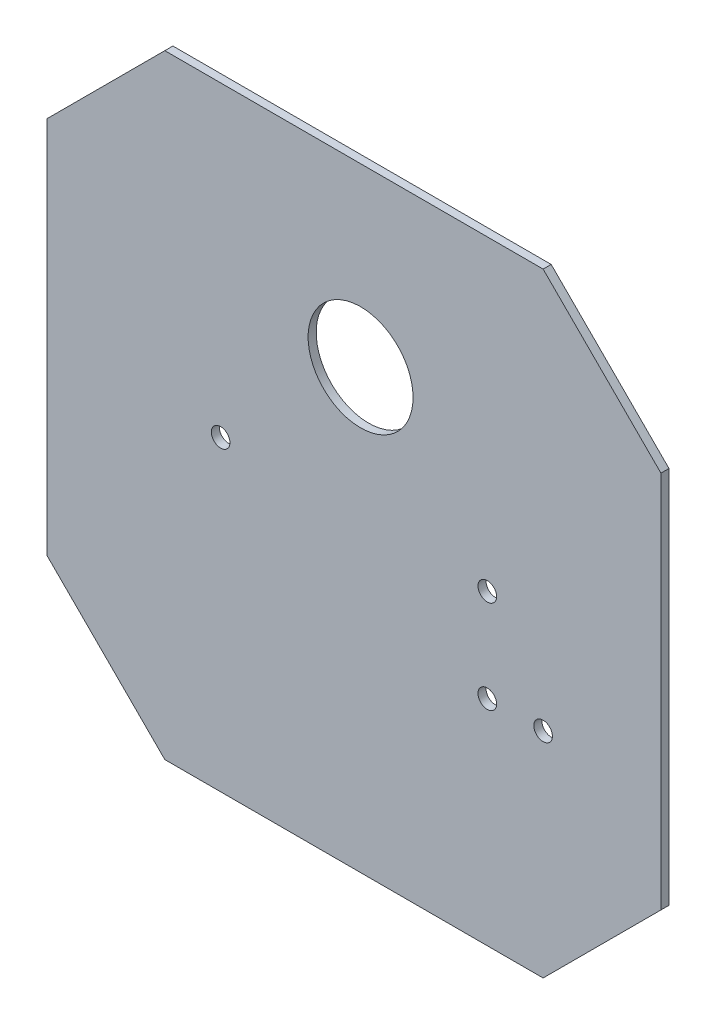
ISO-10303-21;
HEADER;
FILE_DESCRIPTION(('STEP AP214'),'2;1');
FILE_NAME('part.step','',(''),(''),'','','');
FILE_SCHEMA(('AUTOMOTIVE_DESIGN { 1 0 10303 214 1 1 1 1 }'));
ENDSEC;
DATA;
#1=APPLICATION_CONTEXT('core data for automotive mechanical design processes');
#2=APPLICATION_PROTOCOL_DEFINITION('international standard','automotive_design',2000,#1);
#3=PRODUCT_CONTEXT('',#1,'mechanical');
#4=PRODUCT('Part','Part','',(#3));
#5=PRODUCT_RELATED_PRODUCT_CATEGORY('part','',(#4));
#6=PRODUCT_DEFINITION_FORMATION('','',#4);
#7=PRODUCT_DEFINITION_CONTEXT('part definition',#1,'design');
#8=PRODUCT_DEFINITION('design','',#6,#7);
#9=PRODUCT_DEFINITION_SHAPE('','',#8);
#10=(LENGTH_UNIT() NAMED_UNIT(*) SI_UNIT(.MILLI.,.METRE.));
#11=(NAMED_UNIT(*) PLANE_ANGLE_UNIT() SI_UNIT($,.RADIAN.));
#12=(NAMED_UNIT(*) SI_UNIT($,.STERADIAN.) SOLID_ANGLE_UNIT());
#13=UNCERTAINTY_MEASURE_WITH_UNIT(LENGTH_MEASURE(1.E-05),#10,'distance_accuracy_value','');
#14=(GEOMETRIC_REPRESENTATION_CONTEXT(3) GLOBAL_UNCERTAINTY_ASSIGNED_CONTEXT((#13)) GLOBAL_UNIT_ASSIGNED_CONTEXT((#10,
#11,#12)) REPRESENTATION_CONTEXT('',''));
#15=CARTESIAN_POINT('',(0.,0.,0.));
#16=DIRECTION('',(0.,0.,1.));
#17=DIRECTION('',(1.,0.,0.));
#18=AXIS2_PLACEMENT_3D('',#15,#16,#17);
#19=CARTESIAN_POINT('',(0.,0.,1.3));
#20=DIRECTION('',(0.,0.,1.));
#21=DIRECTION('',(1.,0.,0.));
#22=AXIS2_PLACEMENT_3D('',#19,#20,#21);
#23=PLANE('',#22);
#24=CARTESIAN_POINT('',(20.9201037698349,52.6054015670529,1.3));
#25=DIRECTION('',(0.,0.,1.));
#26=DIRECTION('',(1.,0.,0.));
#27=AXIS2_PLACEMENT_3D('',#24,#25,#26);
#28=CIRCLE('',#27,8.46058788280439);
#29=CARTESIAN_POINT('',(29.3806916526393,52.6054015670529,1.3));
#30=VERTEX_POINT('',#29);
#31=EDGE_CURVE('E206',#30,#30,#28,.T.);
#32=ORIENTED_EDGE('',*,*,#31,.F.);
#33=EDGE_LOOP('',(#32));
#34=FACE_BOUND('',#33,.T.);
#35=CARTESIAN_POINT('',(41.3510320460715,16.5347355194417,1.3));
#36=DIRECTION('',(0.,0.,1.));
#37=DIRECTION('',(1.,0.,0.));
#38=AXIS2_PLACEMENT_3D('',#35,#36,#37);
#39=CIRCLE('',#38,1.5);
#40=CARTESIAN_POINT('',(42.8510320460715,16.5347355194417,1.3));
#41=VERTEX_POINT('',#40);
#42=EDGE_CURVE('E192',#41,#41,#39,.T.);
#43=ORIENTED_EDGE('',*,*,#42,.F.);
#44=EDGE_LOOP('',(#43));
#45=FACE_BOUND('',#44,.T.);
#46=CARTESIAN_POINT('',(-1.64896795392847,31.5347355194417,1.3));
#47=DIRECTION('',(0.,0.,1.));
#48=DIRECTION('',(1.,0.,0.));
#49=AXIS2_PLACEMENT_3D('',#46,#47,#48);
#50=CIRCLE('',#49,1.5);
#51=CARTESIAN_POINT('',(-0.148967953928468,31.5347355194417,1.3));
#52=VERTEX_POINT('',#51);
#53=EDGE_CURVE('E137',#52,#52,#50,.T.);
#54=ORIENTED_EDGE('',*,*,#53,.F.);
#55=EDGE_LOOP('',(#54));
#56=FACE_BOUND('',#55,.T.);
#57=DIRECTION('',(-1.,0.,0.));
#58=VECTOR('',#57,1.);
#59=CARTESIAN_POINT('',(50.3510320460715,81.0347355194417,1.3));
#60=LINE('',#59,#58);
#61=CARTESIAN_POINT('',(50.3510320460715,81.0347355194417,1.3));
#62=VERTEX_POINT('',#61);
#63=CARTESIAN_POINT('',(-10.6489679539285,81.0347355194417,1.3));
#64=VERTEX_POINT('',#63);
#65=EDGE_CURVE('E148',#62,#64,#60,.T.);
#66=ORIENTED_EDGE('',*,*,#65,.T.);
#67=DIRECTION('',(-0.707106781186548,-0.707106781186547,0.));
#68=VECTOR('',#67,1.);
#69=CARTESIAN_POINT('',(-10.6489679539285,81.0347355194417,1.3));
#70=LINE('',#69,#68);
#71=CARTESIAN_POINT('',(-29.6489679539285,62.0347355194417,1.3));
#72=VERTEX_POINT('',#71);
#73=EDGE_CURVE('E96',#64,#72,#70,.T.);
#74=ORIENTED_EDGE('',*,*,#73,.T.);
#75=DIRECTION('',(0.,-1.,0.));
#76=VECTOR('',#75,1.);
#77=CARTESIAN_POINT('',(-29.6489679539285,62.0347355194417,1.3));
#78=LINE('',#77,#76);
#79=CARTESIAN_POINT('',(-29.6489679539285,1.03473551944168,1.3));
#80=VERTEX_POINT('',#79);
#81=EDGE_CURVE('E164',#72,#80,#78,.T.);
#82=ORIENTED_EDGE('',*,*,#81,.T.);
#83=DIRECTION('',(0.707106781186548,-0.707106781186548,0.));
#84=VECTOR('',#83,1.);
#85=CARTESIAN_POINT('',(-29.6489679539285,1.03473551944168,1.3));
#86=LINE('',#85,#84);
#87=CARTESIAN_POINT('',(-10.6489679539285,-17.9652644805583,1.3));
#88=VERTEX_POINT('',#87);
#89=EDGE_CURVE('E177',#80,#88,#86,.T.);
#90=ORIENTED_EDGE('',*,*,#89,.T.);
#91=DIRECTION('',(1.,0.,0.));
#92=VECTOR('',#91,1.);
#93=CARTESIAN_POINT('',(-10.6489679539285,-17.9652644805583,1.3));
#94=LINE('',#93,#92);
#95=CARTESIAN_POINT('',(50.3510320460715,-17.9652644805583,1.3));
#96=VERTEX_POINT('',#95);
#97=EDGE_CURVE('E115',#88,#96,#94,.T.);
#98=ORIENTED_EDGE('',*,*,#97,.T.);
#99=DIRECTION('',(0.707106781186548,0.707106781186547,0.));
#100=VECTOR('',#99,1.);
#101=CARTESIAN_POINT('',(50.3510320460715,-17.9652644805583,1.3));
#102=LINE('',#101,#100);
#103=CARTESIAN_POINT('',(69.3510320460715,1.03473551944168,1.3));
#104=VERTEX_POINT('',#103);
#105=EDGE_CURVE('E109',#96,#104,#102,.T.);
#106=ORIENTED_EDGE('',*,*,#105,.T.);
#107=DIRECTION('',(0.,1.,0.));
#108=VECTOR('',#107,1.);
#109=CARTESIAN_POINT('',(69.3510320460715,1.03473551944168,1.3));
#110=LINE('',#109,#108);
#111=CARTESIAN_POINT('',(69.3510320460715,62.0347355194417,1.3));
#112=VERTEX_POINT('',#111);
#113=EDGE_CURVE('E113',#104,#112,#110,.T.);
#114=ORIENTED_EDGE('',*,*,#113,.T.);
#115=DIRECTION('',(-0.707106781186548,0.707106781186547,0.));
#116=VECTOR('',#115,1.);
#117=CARTESIAN_POINT('',(69.3510320460715,62.0347355194417,1.3));
#118=LINE('',#117,#116);
#119=EDGE_CURVE('E53',#112,#62,#118,.T.);
#120=ORIENTED_EDGE('',*,*,#119,.T.);
#121=EDGE_LOOP('',(#66,#74,#82,#90,#98,#106,#114,#120));
#122=FACE_BOUND('',#121,.T.);
#123=CARTESIAN_POINT('',(41.3510320460715,31.5347355194417,1.3));
#124=DIRECTION('',(0.,0.,1.));
#125=DIRECTION('',(1.,0.,0.));
#126=AXIS2_PLACEMENT_3D('',#123,#124,#125);
#127=CIRCLE('',#126,1.5);
#128=CARTESIAN_POINT('',(42.8510320460715,31.5347355194417,1.3));
#129=VERTEX_POINT('',#128);
#130=EDGE_CURVE('E186',#129,#129,#127,.T.);
#131=ORIENTED_EDGE('',*,*,#130,.F.);
#132=EDGE_LOOP('',(#131));
#133=FACE_BOUND('',#132,.T.);
#134=CARTESIAN_POINT('',(50.3510320460715,16.5347355194417,1.3));
#135=DIRECTION('',(0.,0.,1.));
#136=DIRECTION('',(1.,0.,0.));
#137=AXIS2_PLACEMENT_3D('',#134,#135,#136);
#138=CIRCLE('',#137,1.5);
#139=CARTESIAN_POINT('',(51.8510320460715,16.5347355194417,1.3));
#140=VERTEX_POINT('',#139);
#141=EDGE_CURVE('E198',#140,#140,#138,.T.);
#142=ORIENTED_EDGE('',*,*,#141,.F.);
#143=EDGE_LOOP('',(#142));
#144=FACE_BOUND('',#143,.T.);
#145=ADVANCED_FACE('F35',(#34,#45,#56,#122,#133,#144),#23,.T.);
#146=CARTESIAN_POINT('',(0.,0.,0.));
#147=DIRECTION('',(0.,0.,1.));
#148=DIRECTION('',(1.,0.,0.));
#149=AXIS2_PLACEMENT_3D('',#146,#147,#148);
#150=PLANE('',#149);
#151=CARTESIAN_POINT('',(20.9201037698349,52.6054015670529,0.));
#152=DIRECTION('',(0.,0.,1.));
#153=DIRECTION('',(1.,0.,0.));
#154=AXIS2_PLACEMENT_3D('',#151,#152,#153);
#155=CIRCLE('',#154,8.46058788280439);
#156=CARTESIAN_POINT('',(29.3806916526393,52.6054015670529,0.));
#157=VERTEX_POINT('',#156);
#158=EDGE_CURVE('E39',#157,#157,#155,.T.);
#159=ORIENTED_EDGE('',*,*,#158,.T.);
#160=EDGE_LOOP('',(#159));
#161=FACE_BOUND('',#160,.T.);
#162=CARTESIAN_POINT('',(41.3510320460715,16.5347355194417,0.));
#163=DIRECTION('',(0.,0.,1.));
#164=DIRECTION('',(1.,0.,0.));
#165=AXIS2_PLACEMENT_3D('',#162,#163,#164);
#166=CIRCLE('',#165,1.5);
#167=CARTESIAN_POINT('',(42.8510320460715,16.5347355194417,0.));
#168=VERTEX_POINT('',#167);
#169=EDGE_CURVE('E195',#168,#168,#166,.T.);
#170=ORIENTED_EDGE('',*,*,#169,.T.);
#171=EDGE_LOOP('',(#170));
#172=FACE_BOUND('',#171,.T.);
#173=CARTESIAN_POINT('',(-1.64896795392847,31.5347355194417,0.));
#174=DIRECTION('',(0.,0.,1.));
#175=DIRECTION('',(1.,0.,0.));
#176=AXIS2_PLACEMENT_3D('',#173,#174,#175);
#177=CIRCLE('',#176,1.5);
#178=CARTESIAN_POINT('',(-0.148967953928468,31.5347355194417,0.));
#179=VERTEX_POINT('',#178);
#180=EDGE_CURVE('E183',#179,#179,#177,.T.);
#181=ORIENTED_EDGE('',*,*,#180,.T.);
#182=EDGE_LOOP('',(#181));
#183=FACE_BOUND('',#182,.T.);
#184=DIRECTION('',(-1.,0.,0.));
#185=VECTOR('',#184,1.);
#186=CARTESIAN_POINT('',(50.3510320460715,81.0347355194417,0.));
#187=LINE('',#186,#185);
#188=CARTESIAN_POINT('',(50.3510320460715,81.0347355194417,0.));
#189=VERTEX_POINT('',#188);
#190=CARTESIAN_POINT('',(-10.6489679539285,81.0347355194417,0.));
#191=VERTEX_POINT('',#190);
#192=EDGE_CURVE('E133',#189,#191,#187,.T.);
#193=ORIENTED_EDGE('',*,*,#192,.F.);
#194=DIRECTION('',(-0.707106781186548,0.707106781186547,0.));
#195=VECTOR('',#194,1.);
#196=CARTESIAN_POINT('',(69.3510320460715,62.0347355194417,0.));
#197=LINE('',#196,#195);
#198=CARTESIAN_POINT('',(69.3510320460715,62.0347355194417,0.));
#199=VERTEX_POINT('',#198);
#200=EDGE_CURVE('E88',#199,#189,#197,.T.);
#201=ORIENTED_EDGE('',*,*,#200,.F.);
#202=DIRECTION('',(0.,1.,0.));
#203=VECTOR('',#202,1.);
#204=CARTESIAN_POINT('',(69.3510320460715,1.03473551944168,0.));
#205=LINE('',#204,#203);
#206=CARTESIAN_POINT('',(69.3510320460715,1.03473551944168,0.));
#207=VERTEX_POINT('',#206);
#208=EDGE_CURVE('E82',#207,#199,#205,.T.);
#209=ORIENTED_EDGE('',*,*,#208,.F.);
#210=DIRECTION('',(0.707106781186548,0.707106781186547,0.));
#211=VECTOR('',#210,1.);
#212=CARTESIAN_POINT('',(50.3510320460715,-17.9652644805583,0.));
#213=LINE('',#212,#211);
#214=CARTESIAN_POINT('',(50.3510320460715,-17.9652644805583,0.));
#215=VERTEX_POINT('',#214);
#216=EDGE_CURVE('E123',#215,#207,#213,.T.);
#217=ORIENTED_EDGE('',*,*,#216,.F.);
#218=DIRECTION('',(1.,0.,0.));
#219=VECTOR('',#218,1.);
#220=CARTESIAN_POINT('',(-10.6489679539285,-17.9652644805583,0.));
#221=LINE('',#220,#219);
#222=CARTESIAN_POINT('',(-10.6489679539285,-17.9652644805583,0.));
#223=VERTEX_POINT('',#222);
#224=EDGE_CURVE('E143',#223,#215,#221,.T.);
#225=ORIENTED_EDGE('',*,*,#224,.F.);
#226=DIRECTION('',(0.707106781186548,-0.707106781186548,0.));
#227=VECTOR('',#226,1.);
#228=CARTESIAN_POINT('',(-29.6489679539285,1.03473551944168,0.));
#229=LINE('',#228,#227);
#230=CARTESIAN_POINT('',(-29.6489679539285,1.03473551944168,0.));
#231=VERTEX_POINT('',#230);
#232=EDGE_CURVE('E141',#231,#223,#229,.T.);
#233=ORIENTED_EDGE('',*,*,#232,.F.);
#234=DIRECTION('',(0.,-1.,0.));
#235=VECTOR('',#234,1.);
#236=CARTESIAN_POINT('',(-29.6489679539285,62.0347355194417,0.));
#237=LINE('',#236,#235);
#238=CARTESIAN_POINT('',(-29.6489679539285,62.0347355194417,0.));
#239=VERTEX_POINT('',#238);
#240=EDGE_CURVE('E139',#239,#231,#237,.T.);
#241=ORIENTED_EDGE('',*,*,#240,.F.);
#242=DIRECTION('',(-0.707106781186548,-0.707106781186547,0.));
#243=VECTOR('',#242,1.);
#244=CARTESIAN_POINT('',(-10.6489679539285,81.0347355194417,0.));
#245=LINE('',#244,#243);
#246=EDGE_CURVE('E136',#191,#239,#245,.T.);
#247=ORIENTED_EDGE('',*,*,#246,.F.);
#248=EDGE_LOOP('',(#193,#201,#209,#217,#225,#233,#241,#247));
#249=FACE_BOUND('',#248,.T.);
#250=CARTESIAN_POINT('',(41.3510320460715,31.5347355194417,0.));
#251=DIRECTION('',(0.,0.,1.));
#252=DIRECTION('',(1.,0.,0.));
#253=AXIS2_PLACEMENT_3D('',#250,#251,#252);
#254=CIRCLE('',#253,1.5);
#255=CARTESIAN_POINT('',(42.8510320460715,31.5347355194417,0.));
#256=VERTEX_POINT('',#255);
#257=EDGE_CURVE('E189',#256,#256,#254,.T.);
#258=ORIENTED_EDGE('',*,*,#257,.T.);
#259=EDGE_LOOP('',(#258));
#260=FACE_BOUND('',#259,.T.);
#261=CARTESIAN_POINT('',(50.3510320460715,16.5347355194417,0.));
#262=DIRECTION('',(0.,0.,1.));
#263=DIRECTION('',(1.,0.,0.));
#264=AXIS2_PLACEMENT_3D('',#261,#262,#263);
#265=CIRCLE('',#264,1.5);
#266=CARTESIAN_POINT('',(51.8510320460715,16.5347355194417,0.));
#267=VERTEX_POINT('',#266);
#268=EDGE_CURVE('E201',#267,#267,#265,.T.);
#269=ORIENTED_EDGE('',*,*,#268,.T.);
#270=EDGE_LOOP('',(#269));
#271=FACE_BOUND('',#270,.T.);
#272=ADVANCED_FACE('F168',(#161,#172,#183,#249,#260,#271),#150,.F.);
#273=CARTESIAN_POINT('',(50.3510320460715,81.0347355194417,1.3));
#274=DIRECTION('',(0.,-1.,0.));
#275=DIRECTION('',(0.,0.,-1.));
#276=AXIS2_PLACEMENT_3D('',#273,#274,#275);
#277=PLANE('',#276);
#278=ORIENTED_EDGE('',*,*,#192,.T.);
#279=DIRECTION('',(0.,0.,-1.));
#280=VECTOR('',#279,1.);
#281=CARTESIAN_POINT('',(-10.6489679539285,81.0347355194417,1.3));
#282=LINE('',#281,#280);
#283=EDGE_CURVE('E11',#64,#191,#282,.T.);
#284=ORIENTED_EDGE('',*,*,#283,.F.);
#285=ORIENTED_EDGE('',*,*,#65,.F.);
#286=DIRECTION('',(0.,0.,-1.));
#287=VECTOR('',#286,1.);
#288=CARTESIAN_POINT('',(50.3510320460715,81.0347355194417,1.3));
#289=LINE('',#288,#287);
#290=EDGE_CURVE('E129',#62,#189,#289,.T.);
#291=ORIENTED_EDGE('',*,*,#290,.T.);
#292=EDGE_LOOP('',(#278,#284,#285,#291));
#293=FACE_BOUND('',#292,.T.);
#294=ADVANCED_FACE('F37',(#293),#277,.F.);
#295=CARTESIAN_POINT('',(-10.6489679539285,81.0347355194417,1.3));
#296=DIRECTION('',(0.707106781186547,-0.707106781186548,0.));
#297=DIRECTION('',(0.707106781186548,0.707106781186547,0.));
#298=AXIS2_PLACEMENT_3D('',#295,#296,#297);
#299=PLANE('',#298);
#300=ORIENTED_EDGE('',*,*,#246,.T.);
#301=DIRECTION('',(0.,0.,-1.));
#302=VECTOR('',#301,1.);
#303=CARTESIAN_POINT('',(-29.6489679539285,62.0347355194417,1.3));
#304=LINE('',#303,#302);
#305=EDGE_CURVE('E45',#72,#239,#304,.T.);
#306=ORIENTED_EDGE('',*,*,#305,.F.);
#307=ORIENTED_EDGE('',*,*,#73,.F.);
#308=ORIENTED_EDGE('',*,*,#283,.T.);
#309=EDGE_LOOP('',(#300,#306,#307,#308));
#310=FACE_BOUND('',#309,.T.);
#311=ADVANCED_FACE('F250',(#310),#299,.F.);
#312=CARTESIAN_POINT('',(-29.6489679539285,62.0347355194417,1.3));
#313=DIRECTION('',(1.,0.,0.));
#314=DIRECTION('',(0.,1.,0.));
#315=AXIS2_PLACEMENT_3D('',#312,#313,#314);
#316=PLANE('',#315);
#317=ORIENTED_EDGE('',*,*,#240,.T.);
#318=DIRECTION('',(0.,0.,-1.));
#319=VECTOR('',#318,1.);
#320=CARTESIAN_POINT('',(-29.6489679539285,1.03473551944168,1.3));
#321=LINE('',#320,#319);
#322=EDGE_CURVE('E155',#80,#231,#321,.T.);
#323=ORIENTED_EDGE('',*,*,#322,.F.);
#324=ORIENTED_EDGE('',*,*,#81,.F.);
#325=ORIENTED_EDGE('',*,*,#305,.T.);
#326=EDGE_LOOP('',(#317,#323,#324,#325));
#327=FACE_BOUND('',#326,.T.);
#328=ADVANCED_FACE('F162',(#327),#316,.F.);
#329=CARTESIAN_POINT('',(-29.6489679539285,1.03473551944168,1.3));
#330=DIRECTION('',(0.707106781186547,0.707106781186548,0.));
#331=DIRECTION('',(-0.707106781186548,0.707106781186547,0.));
#332=AXIS2_PLACEMENT_3D('',#329,#330,#331);
#333=PLANE('',#332);
#334=ORIENTED_EDGE('',*,*,#232,.T.);
#335=DIRECTION('',(0.,0.,-1.));
#336=VECTOR('',#335,1.);
#337=CARTESIAN_POINT('',(-10.6489679539285,-17.9652644805583,1.3));
#338=LINE('',#337,#336);
#339=EDGE_CURVE('E152',#88,#223,#338,.T.);
#340=ORIENTED_EDGE('',*,*,#339,.F.);
#341=ORIENTED_EDGE('',*,*,#89,.F.);
#342=ORIENTED_EDGE('',*,*,#322,.T.);
#343=EDGE_LOOP('',(#334,#340,#341,#342));
#344=FACE_BOUND('',#343,.T.);
#345=ADVANCED_FACE('F173',(#344),#333,.F.);
#346=CARTESIAN_POINT('',(-10.6489679539285,-17.9652644805583,1.3));
#347=DIRECTION('',(0.,1.,0.));
#348=DIRECTION('',(0.,0.,1.));
#349=AXIS2_PLACEMENT_3D('',#346,#347,#348);
#350=PLANE('',#349);
#351=ORIENTED_EDGE('',*,*,#224,.T.);
#352=DIRECTION('',(0.,0.,-1.));
#353=VECTOR('',#352,1.);
#354=CARTESIAN_POINT('',(50.3510320460715,-17.9652644805583,1.3));
#355=LINE('',#354,#353);
#356=EDGE_CURVE('E124',#96,#215,#355,.T.);
#357=ORIENTED_EDGE('',*,*,#356,.F.);
#358=ORIENTED_EDGE('',*,*,#97,.F.);
#359=ORIENTED_EDGE('',*,*,#339,.T.);
#360=EDGE_LOOP('',(#351,#357,#358,#359));
#361=FACE_BOUND('',#360,.T.);
#362=ADVANCED_FACE('F176',(#361),#350,.F.);
#363=CARTESIAN_POINT('',(50.3510320460715,-17.9652644805583,1.3));
#364=DIRECTION('',(-0.707106781186547,0.707106781186548,0.));
#365=DIRECTION('',(-0.707106781186548,-0.707106781186547,0.));
#366=AXIS2_PLACEMENT_3D('',#363,#364,#365);
#367=PLANE('',#366);
#368=ORIENTED_EDGE('',*,*,#216,.T.);
#369=DIRECTION('',(0.,0.,-1.));
#370=VECTOR('',#369,1.);
#371=CARTESIAN_POINT('',(69.3510320460715,1.03473551944168,1.3));
#372=LINE('',#371,#370);
#373=EDGE_CURVE('E120',#104,#207,#372,.T.);
#374=ORIENTED_EDGE('',*,*,#373,.F.);
#375=ORIENTED_EDGE('',*,*,#105,.F.);
#376=ORIENTED_EDGE('',*,*,#356,.T.);
#377=EDGE_LOOP('',(#368,#374,#375,#376));
#378=FACE_BOUND('',#377,.T.);
#379=ADVANCED_FACE('F121',(#378),#367,.F.);
#380=CARTESIAN_POINT('',(69.3510320460715,1.03473551944168,1.3));
#381=DIRECTION('',(-1.,0.,0.));
#382=DIRECTION('',(0.,-1.,0.));
#383=AXIS2_PLACEMENT_3D('',#380,#381,#382);
#384=PLANE('',#383);
#385=ORIENTED_EDGE('',*,*,#208,.T.);
#386=DIRECTION('',(0.,0.,-1.));
#387=VECTOR('',#386,1.);
#388=CARTESIAN_POINT('',(69.3510320460715,62.0347355194417,1.3));
#389=LINE('',#388,#387);
#390=EDGE_CURVE('E125',#112,#199,#389,.T.);
#391=ORIENTED_EDGE('',*,*,#390,.F.);
#392=ORIENTED_EDGE('',*,*,#113,.F.);
#393=ORIENTED_EDGE('',*,*,#373,.T.);
#394=EDGE_LOOP('',(#385,#391,#392,#393));
#395=FACE_BOUND('',#394,.T.);
#396=ADVANCED_FACE('F127',(#395),#384,.F.);
#397=CARTESIAN_POINT('',(69.3510320460715,62.0347355194417,1.3));
#398=DIRECTION('',(-0.707106781186547,-0.707106781186548,0.));
#399=DIRECTION('',(0.707106781186548,-0.707106781186547,0.));
#400=AXIS2_PLACEMENT_3D('',#397,#398,#399);
#401=PLANE('',#400);
#402=ORIENTED_EDGE('',*,*,#200,.T.);
#403=ORIENTED_EDGE('',*,*,#290,.F.);
#404=ORIENTED_EDGE('',*,*,#119,.F.);
#405=ORIENTED_EDGE('',*,*,#390,.T.);
#406=EDGE_LOOP('',(#402,#403,#404,#405));
#407=FACE_BOUND('',#406,.T.);
#408=ADVANCED_FACE('F238',(#407),#401,.F.);
#409=CARTESIAN_POINT('',(-1.64896795392847,31.5347355194417,1.3));
#410=DIRECTION('',(0.,0.,-1.));
#411=DIRECTION('',(-1.,0.,0.));
#412=AXIS2_PLACEMENT_3D('',#409,#410,#411);
#413=CYLINDRICAL_SURFACE('',#412,1.5);
#414=ORIENTED_EDGE('',*,*,#53,.T.);
#415=EDGE_LOOP('',(#414));
#416=FACE_BOUND('',#415,.T.);
#417=ORIENTED_EDGE('',*,*,#180,.F.);
#418=EDGE_LOOP('',(#417));
#419=FACE_BOUND('',#418,.T.);
#420=ADVANCED_FACE('F235',(#416,#419),#413,.F.);
#421=CARTESIAN_POINT('',(41.3510320460715,31.5347355194417,1.3));
#422=DIRECTION('',(0.,0.,-1.));
#423=DIRECTION('',(-1.,0.,0.));
#424=AXIS2_PLACEMENT_3D('',#421,#422,#423);
#425=CYLINDRICAL_SURFACE('',#424,1.5);
#426=ORIENTED_EDGE('',*,*,#130,.T.);
#427=EDGE_LOOP('',(#426));
#428=FACE_BOUND('',#427,.T.);
#429=ORIENTED_EDGE('',*,*,#257,.F.);
#430=EDGE_LOOP('',(#429));
#431=FACE_BOUND('',#430,.T.);
#432=ADVANCED_FACE('F286',(#428,#431),#425,.F.);
#433=CARTESIAN_POINT('',(41.3510320460715,16.5347355194417,1.3));
#434=DIRECTION('',(0.,0.,-1.));
#435=DIRECTION('',(-1.,0.,0.));
#436=AXIS2_PLACEMENT_3D('',#433,#434,#435);
#437=CYLINDRICAL_SURFACE('',#436,1.5);
#438=ORIENTED_EDGE('',*,*,#42,.T.);
#439=EDGE_LOOP('',(#438));
#440=FACE_BOUND('',#439,.T.);
#441=ORIENTED_EDGE('',*,*,#169,.F.);
#442=EDGE_LOOP('',(#441));
#443=FACE_BOUND('',#442,.T.);
#444=ADVANCED_FACE('F222',(#440,#443),#437,.F.);
#445=CARTESIAN_POINT('',(50.3510320460715,16.5347355194417,1.3));
#446=DIRECTION('',(0.,0.,-1.));
#447=DIRECTION('',(-1.,0.,0.));
#448=AXIS2_PLACEMENT_3D('',#445,#446,#447);
#449=CYLINDRICAL_SURFACE('',#448,1.5);
#450=ORIENTED_EDGE('',*,*,#141,.T.);
#451=EDGE_LOOP('',(#450));
#452=FACE_BOUND('',#451,.T.);
#453=ORIENTED_EDGE('',*,*,#268,.F.);
#454=EDGE_LOOP('',(#453));
#455=FACE_BOUND('',#454,.T.);
#456=ADVANCED_FACE('F217',(#452,#455),#449,.F.);
#457=CARTESIAN_POINT('',(20.9201037698349,52.6054015670529,-18.7));
#458=DIRECTION('',(0.,0.,1.));
#459=DIRECTION('',(1.,0.,0.));
#460=AXIS2_PLACEMENT_3D('',#457,#458,#459);
#461=CYLINDRICAL_SURFACE('',#460,8.46058788280439);
#462=ORIENTED_EDGE('',*,*,#31,.T.);
#463=EDGE_LOOP('',(#462));
#464=FACE_BOUND('',#463,.T.);
#465=ORIENTED_EDGE('',*,*,#158,.F.);
#466=EDGE_LOOP('',(#465));
#467=FACE_BOUND('',#466,.T.);
#468=ADVANCED_FACE('F215',(#464,#467),#461,.F.);
#469=CLOSED_SHELL('',(#145,#272,#294,#311,#328,#345,#362,#379,#396,#408,#420,#432,#444,#456,#468));
#470=MANIFOLD_SOLID_BREP('B2',#469);
#471=ADVANCED_BREP_SHAPE_REPRESENTATION('',(#18,#470),#14);
#472=SHAPE_DEFINITION_REPRESENTATION(#9,#471);
ENDSEC;
END-ISO-10303-21;
